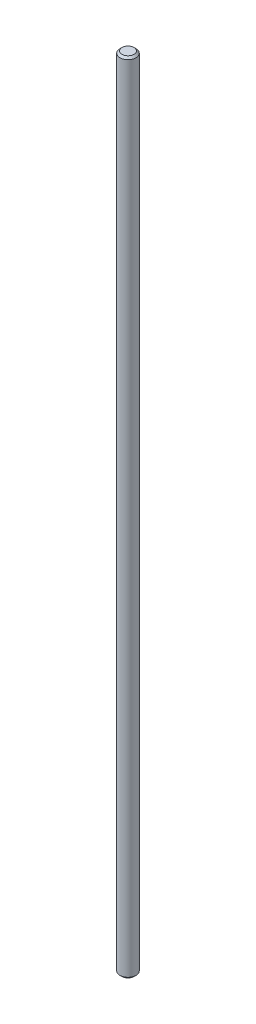
ISO-10303-21;
HEADER;
FILE_DESCRIPTION(('STEP AP214'),'2;1');
FILE_NAME('part.step','',(''),(''),'','','');
FILE_SCHEMA(('AUTOMOTIVE_DESIGN { 1 0 10303 214 1 1 1 1 }'));
ENDSEC;
DATA;
#1=APPLICATION_CONTEXT('core data for automotive mechanical design processes');
#2=APPLICATION_PROTOCOL_DEFINITION('international standard','automotive_design',2000,#1);
#3=PRODUCT_CONTEXT('',#1,'mechanical');
#4=PRODUCT('Part','Part','',(#3));
#5=PRODUCT_RELATED_PRODUCT_CATEGORY('part','',(#4));
#6=PRODUCT_DEFINITION_FORMATION('','',#4);
#7=PRODUCT_DEFINITION_CONTEXT('part definition',#1,'design');
#8=PRODUCT_DEFINITION('design','',#6,#7);
#9=PRODUCT_DEFINITION_SHAPE('','',#8);
#10=(LENGTH_UNIT() NAMED_UNIT(*) SI_UNIT(.MILLI.,.METRE.));
#11=(NAMED_UNIT(*) PLANE_ANGLE_UNIT() SI_UNIT($,.RADIAN.));
#12=(NAMED_UNIT(*) SI_UNIT($,.STERADIAN.) SOLID_ANGLE_UNIT());
#13=UNCERTAINTY_MEASURE_WITH_UNIT(LENGTH_MEASURE(1.E-05),#10,'distance_accuracy_value','');
#14=(GEOMETRIC_REPRESENTATION_CONTEXT(3) GLOBAL_UNCERTAINTY_ASSIGNED_CONTEXT((#13)) GLOBAL_UNIT_ASSIGNED_CONTEXT((#10,
#11,#12)) REPRESENTATION_CONTEXT('',''));
#15=CARTESIAN_POINT('',(0.,0.,0.));
#16=DIRECTION('',(0.,0.,1.));
#17=DIRECTION('',(1.,0.,0.));
#18=AXIS2_PLACEMENT_3D('',#15,#16,#17);
#19=CARTESIAN_POINT('',(0.,400.,0.));
#20=DIRECTION('',(0.,-1.,0.));
#21=DIRECTION('',(0.,0.,-1.));
#22=AXIS2_PLACEMENT_3D('',#19,#20,#21);
#23=CYLINDRICAL_SURFACE('',#22,4.);
#24=CARTESIAN_POINT('',(0.,399.,0.));
#25=DIRECTION('',(0.,1.,0.));
#26=DIRECTION('',(0.,0.,1.));
#27=AXIS2_PLACEMENT_3D('',#24,#25,#26);
#28=CIRCLE('',#27,4.);
#29=CARTESIAN_POINT('',(0.,399.,4.));
#30=VERTEX_POINT('',#29);
#31=EDGE_CURVE('E46',#30,#30,#28,.F.);
#32=ORIENTED_EDGE('',*,*,#31,.T.);
#33=EDGE_LOOP('',(#32));
#34=FACE_BOUND('',#33,.T.);
#35=CARTESIAN_POINT('',(0.,1.,0.));
#36=DIRECTION('',(0.,1.,0.));
#37=DIRECTION('',(0.,0.,1.));
#38=AXIS2_PLACEMENT_3D('',#35,#36,#37);
#39=CIRCLE('',#38,4.);
#40=CARTESIAN_POINT('',(0.,1.,4.));
#41=VERTEX_POINT('',#40);
#42=EDGE_CURVE('E50',#41,#41,#39,.T.);
#43=ORIENTED_EDGE('',*,*,#42,.T.);
#44=EDGE_LOOP('',(#43));
#45=FACE_BOUND('',#44,.T.);
#46=ADVANCED_FACE('F38',(#34,#45),#23,.T.);
#47=CARTESIAN_POINT('',(0.,400.,0.));
#48=DIRECTION('',(0.,1.,0.));
#49=DIRECTION('',(0.,0.,1.));
#50=AXIS2_PLACEMENT_3D('',#47,#48,#49);
#51=PLANE('',#50);
#52=CARTESIAN_POINT('',(0.,400.,0.));
#53=DIRECTION('',(0.,1.,0.));
#54=DIRECTION('',(0.,0.,1.));
#55=AXIS2_PLACEMENT_3D('',#52,#53,#54);
#56=CIRCLE('',#55,3.);
#57=CARTESIAN_POINT('',(0.,400.,3.));
#58=VERTEX_POINT('',#57);
#59=EDGE_CURVE('E54',#58,#58,#56,.T.);
#60=ORIENTED_EDGE('',*,*,#59,.T.);
#61=EDGE_LOOP('',(#60));
#62=FACE_BOUND('',#61,.T.);
#63=ADVANCED_FACE('F60',(#62),#51,.T.);
#64=CARTESIAN_POINT('',(0.,0.,0.));
#65=DIRECTION('',(0.,1.,0.));
#66=DIRECTION('',(0.,0.,1.));
#67=AXIS2_PLACEMENT_3D('',#64,#65,#66);
#68=PLANE('',#67);
#69=CARTESIAN_POINT('',(0.,0.,0.));
#70=DIRECTION('',(0.,1.,0.));
#71=DIRECTION('',(0.,0.,1.));
#72=AXIS2_PLACEMENT_3D('',#69,#70,#71);
#73=CIRCLE('',#72,3.00000000000006);
#74=CARTESIAN_POINT('',(0.,0.,3.00000000000006));
#75=VERTEX_POINT('',#74);
#76=EDGE_CURVE('E10',#75,#75,#73,.F.);
#77=ORIENTED_EDGE('',*,*,#76,.T.);
#78=EDGE_LOOP('',(#77));
#79=FACE_BOUND('',#78,.T.);
#80=ADVANCED_FACE('F64',(#79),#68,.F.);
#81=CARTESIAN_POINT('',(0.,400.,0.));
#82=DIRECTION('',(0.,-1.,0.));
#83=DIRECTION('',(0.,0.,-1.));
#84=AXIS2_PLACEMENT_3D('',#81,#82,#83);
#85=CONICAL_SURFACE('',#84,3.,0.785398163397447);
#86=ORIENTED_EDGE('',*,*,#31,.F.);
#87=EDGE_LOOP('',(#86));
#88=FACE_BOUND('',#87,.T.);
#89=ORIENTED_EDGE('',*,*,#59,.F.);
#90=EDGE_LOOP('',(#89));
#91=FACE_BOUND('',#90,.T.);
#92=ADVANCED_FACE('F62',(#88,#91),#85,.T.);
#93=CARTESIAN_POINT('',(0.,1.,0.));
#94=DIRECTION('',(0.,1.,0.));
#95=DIRECTION('',(0.,0.,1.));
#96=AXIS2_PLACEMENT_3D('',#93,#94,#95);
#97=CONICAL_SURFACE('',#96,4.,0.785398163397419);
#98=ORIENTED_EDGE('',*,*,#76,.F.);
#99=EDGE_LOOP('',(#98));
#100=FACE_BOUND('',#99,.T.);
#101=ORIENTED_EDGE('',*,*,#42,.F.);
#102=EDGE_LOOP('',(#101));
#103=FACE_BOUND('',#102,.T.);
#104=ADVANCED_FACE('F41',(#100,#103),#97,.T.);
#105=CLOSED_SHELL('',(#46,#63,#80,#92,#104));
#106=MANIFOLD_SOLID_BREP('B2',#105);
#107=ADVANCED_BREP_SHAPE_REPRESENTATION('',(#18,#106),#14);
#108=SHAPE_DEFINITION_REPRESENTATION(#9,#107);
ENDSEC;
END-ISO-10303-21;
